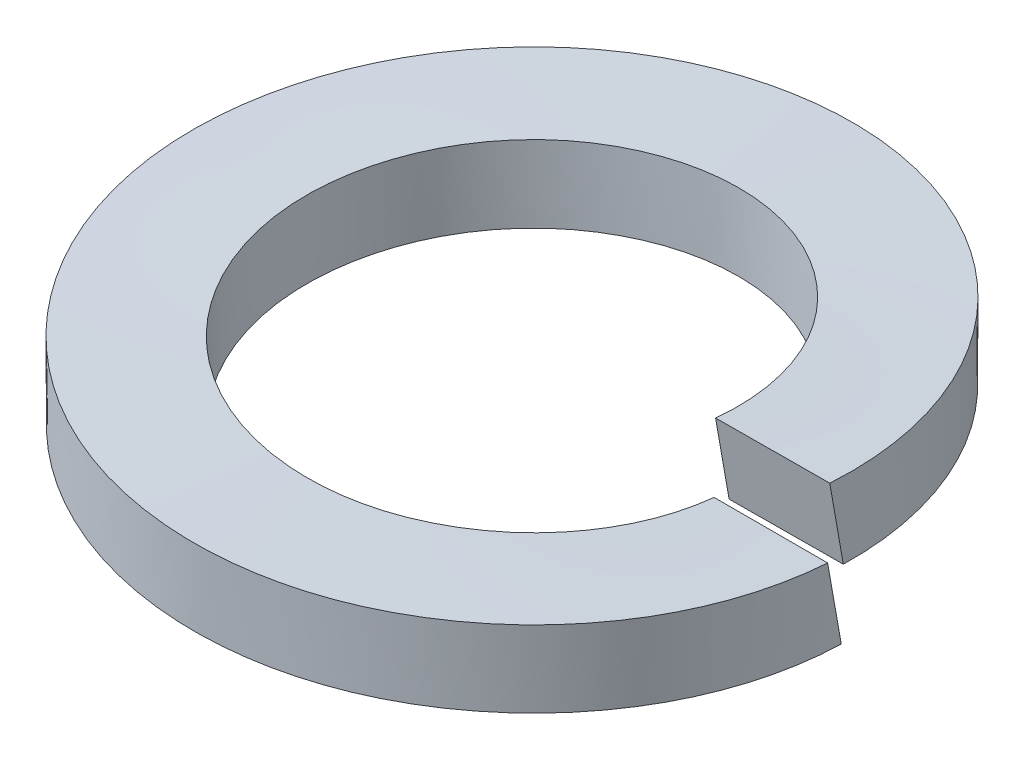
ISO-10303-21;
HEADER;
FILE_DESCRIPTION(('STEP AP214'),'2;1');
FILE_NAME('part.step','',(''),(''),'','','');
FILE_SCHEMA(('AUTOMOTIVE_DESIGN { 1 0 10303 214 1 1 1 1 }'));
ENDSEC;
DATA;
#1=APPLICATION_CONTEXT('core data for automotive mechanical design processes');
#2=APPLICATION_PROTOCOL_DEFINITION('international standard','automotive_design',2000,#1);
#3=PRODUCT_CONTEXT('',#1,'mechanical');
#4=PRODUCT('Part','Part','',(#3));
#5=PRODUCT_RELATED_PRODUCT_CATEGORY('part','',(#4));
#6=PRODUCT_DEFINITION_FORMATION('','',#4);
#7=PRODUCT_DEFINITION_CONTEXT('part definition',#1,'design');
#8=PRODUCT_DEFINITION('design','',#6,#7);
#9=PRODUCT_DEFINITION_SHAPE('','',#8);
#10=(LENGTH_UNIT() NAMED_UNIT(*) SI_UNIT(.MILLI.,.METRE.));
#11=(NAMED_UNIT(*) PLANE_ANGLE_UNIT() SI_UNIT($,.RADIAN.));
#12=(NAMED_UNIT(*) SI_UNIT($,.STERADIAN.) SOLID_ANGLE_UNIT());
#13=UNCERTAINTY_MEASURE_WITH_UNIT(LENGTH_MEASURE(1.E-05),#10,'distance_accuracy_value','');
#14=(GEOMETRIC_REPRESENTATION_CONTEXT(3) GLOBAL_UNCERTAINTY_ASSIGNED_CONTEXT((#13)) GLOBAL_UNIT_ASSIGNED_CONTEXT((#10,
#11,#12)) REPRESENTATION_CONTEXT('',''));
#15=CARTESIAN_POINT('',(0.,0.,0.));
#16=DIRECTION('',(0.,0.,1.));
#17=DIRECTION('',(1.,0.,0.));
#18=AXIS2_PLACEMENT_3D('',#15,#16,#17);
#19=CARTESIAN_POINT('',(9.50000000000001,0.,0.));
#20=DIRECTION('',(0.,-0.173648177666931,0.984807753012208));
#21=DIRECTION('',(0.,-0.984807753012208,-0.173648177666931));
#22=AXIS2_PLACEMENT_3D('',#19,#20,#21);
#23=PLANE('',#22);
#24=DIRECTION('',(0.,-0.984807753012208,-0.173648177666931));
#25=VECTOR('',#24,1.);
#26=CARTESIAN_POINT('',(9.50000000000001,3.39446208637528,0.598535250819876));
#27=LINE('',#26,#25);
#28=CARTESIAN_POINT('',(9.50000000000001,3.39446208637528,0.598535250819876));
#29=VERTEX_POINT('',#28);
#30=CARTESIAN_POINT('',(9.50000000000001,0.,0.));
#31=VERTEX_POINT('',#30);
#32=EDGE_CURVE('E72',#29,#31,#27,.T.);
#33=ORIENTED_EDGE('',*,*,#32,.F.);
#34=DIRECTION('',(-1.,0.,0.));
#35=VECTOR('',#34,1.);
#36=CARTESIAN_POINT('',(9.50000000000001,3.39446208637528,0.598535250819876));
#37=LINE('',#36,#35);
#38=CARTESIAN_POINT('',(14.5,3.39446208637528,0.598535250819876));
#39=VERTEX_POINT('',#38);
#40=EDGE_CURVE('E60',#39,#29,#37,.T.);
#41=ORIENTED_EDGE('',*,*,#40,.F.);
#42=DIRECTION('',(0.,0.984807753012208,0.173648177666931));
#43=VECTOR('',#42,1.);
#44=CARTESIAN_POINT('',(14.5,3.39446208637528,0.598535250819876));
#45=LINE('',#44,#43);
#46=CARTESIAN_POINT('',(14.5,0.,0.));
#47=VERTEX_POINT('',#46);
#48=EDGE_CURVE('E65',#47,#39,#45,.T.);
#49=ORIENTED_EDGE('',*,*,#48,.F.);
#50=DIRECTION('',(1.,0.,0.));
#51=VECTOR('',#50,1.);
#52=CARTESIAN_POINT('',(9.50000000000001,0.,0.));
#53=LINE('',#52,#51);
#54=EDGE_CURVE('E69',#31,#47,#53,.T.);
#55=ORIENTED_EDGE('',*,*,#54,.F.);
#56=EDGE_LOOP('',(#33,#41,#49,#55));
#57=FACE_BOUND('',#56,.T.);
#58=ADVANCED_FACE('F30',(#57),#23,.F.);
#59=CARTESIAN_POINT('',(9.49981247813331,2.99999999999989,-0.0596898676726854));
#60=DIRECTION('',(0.00618768889056106,-0.173648177666931,0.984788313750294));
#61=DIRECTION('',(-0.00109105649963595,-0.984807753012208,-0.17364475000057));
#62=AXIS2_PLACEMENT_3D('',#59,#60,#61);
#63=PLANE('',#62);
#64=DIRECTION('',(-0.00109105649963595,-0.984807753012208,-0.17364475000057));
#65=VECTOR('',#64,1.);
#66=CARTESIAN_POINT('',(9.5035731612827,6.3944620863754,0.538833568573871));
#67=LINE('',#66,#65);
#68=CARTESIAN_POINT('',(9.5035731612827,6.3944620863754,0.53883356857376));
#69=VERTEX_POINT('',#68);
#70=CARTESIAN_POINT('',(9.49981247813331,2.99999999999989,-0.0596898676726854));
#71=VERTEX_POINT('',#70);
#72=EDGE_CURVE('E86',#69,#71,#67,.T.);
#73=ORIENTED_EDGE('',*,*,#72,.T.);
#74=DIRECTION('',(0.999980260856137,0.,-0.00628314396554548));
#75=VECTOR('',#74,1.);
#76=CARTESIAN_POINT('',(9.49981247813331,2.99999999999989,-0.0596898676726854));
#77=LINE('',#76,#75);
#78=CARTESIAN_POINT('',(14.499713782414,2.99999999999989,-0.0911055875003619));
#79=VERTEX_POINT('',#78);
#80=EDGE_CURVE('E49',#71,#79,#77,.T.);
#81=ORIENTED_EDGE('',*,*,#80,.T.);
#82=DIRECTION('',(0.00109105649963595,0.984807753012208,0.17364475000057));
#83=VECTOR('',#82,1.);
#84=CARTESIAN_POINT('',(14.5034744655633,6.3944620863754,0.507417848746083));
#85=LINE('',#84,#83);
#86=CARTESIAN_POINT('',(14.5034744655633,6.3944620863754,0.507417848746083));
#87=VERTEX_POINT('',#86);
#88=EDGE_CURVE('E43',#79,#87,#85,.T.);
#89=ORIENTED_EDGE('',*,*,#88,.T.);
#90=DIRECTION('',(-0.999980260856137,0.,0.00628314396554548));
#91=VECTOR('',#90,1.);
#92=CARTESIAN_POINT('',(9.5035731612827,6.3944620863754,0.538833568573871));
#93=LINE('',#92,#91);
#94=EDGE_CURVE('E11',#87,#69,#93,.T.);
#95=ORIENTED_EDGE('',*,*,#94,.T.);
#96=EDGE_LOOP('',(#73,#81,#89,#95));
#97=FACE_BOUND('',#96,.T.);
#98=ADVANCED_FACE('F131',(#97),#63,.T.);
#99=CARTESIAN_POINT('',(9.50000000000001,3.39446208637528,0.598535250819876));
#100=CARTESIAN_POINT('',(9.15485324201067,3.64446208637537,6.07673256068097));
#101=CARTESIAN_POINT('',(4.24057988513876,3.89446208637545,8.52207291005136));
#102=CARTESIAN_POINT('',(-0.67369347173312,4.14446208637536,10.9674132594217));
#103=CARTESIAN_POINT('',(-5.25173088032527,4.39446208637539,7.93899031408352));
#104=CARTESIAN_POINT('',(-9.82976828891745,4.64446208637534,4.91056736874536));
#105=CARTESIAN_POINT('',(-9.50183347027145,4.89446208637534,-0.568687216053521));
#106=CARTESIAN_POINT('',(-9.17389865162553,5.14446208637533,-6.04794180085235));
#107=CARTESIAN_POINT('',(-4.26733179634092,5.39446208637528,-8.50870870264175));
#108=CARTESIAN_POINT('',(0.639235058943686,5.64446208637531,-10.9694756044312));
#109=CARTESIAN_POINT('',(5.22676393147231,5.89446208637545,-7.95544990878172));
#110=CARTESIAN_POINT('',(9.814292804001,6.14446208637529,-4.94142421313212));
#111=CARTESIAN_POINT('',(9.5035731612827,6.3944620863754,0.53883356857376));
#112=CARTESIAN_POINT('',(9.50000000000001,0.,0.));
#113=CARTESIAN_POINT('',(9.49999999999995,0.250000000000056,5.47819730986108));
#114=CARTESIAN_POINT('',(4.75861294092672,0.499999999999945,8.22226263740367));
#115=CARTESIAN_POINT('',(0.017225881853432,0.75000000000004,10.9663279649463));
#116=CARTESIAN_POINT('',(-4.73275850072519,0.99999999999989,8.23717166106264));
#117=CARTESIAN_POINT('',(-9.48274288330385,1.25000000000002,5.50801535717899));
#118=CARTESIAN_POINT('',(-9.49995311941765,1.50000000000006,0.0298450811158091));
#119=CARTESIAN_POINT('',(-9.51716335553147,1.75000000000001,-5.44832519494737));
#120=CARTESIAN_POINT('',(-4.78442041553967,2.,-8.20727246333197));
#121=CARTESIAN_POINT('',(-0.0516774755478602,2.24999999999999,-10.9662197317166));
#122=CARTESIAN_POINT('',(4.70685735010795,2.49999999999995,-8.25199938716281));
#123=CARTESIAN_POINT('',(9.46539217576376,2.74999999999998,-5.53777904260892));
#124=CARTESIAN_POINT('',(9.49981247813331,2.99999999999989,-0.0596898676726854));
#125=(BOUNDED_SURFACE() B_SPLINE_SURFACE(1,2,((#99,#100,#101,#102,#103,#104,#105,#106,#107,#108,
#109,#110,#111),(#112,#113,#114,#115,#116,#117,#118,#119,#120,#121,#122,#123,#124)),
.UNSPECIFIED.,.F.,.F.,.F.) B_SPLINE_SURFACE_WITH_KNOTS((2,2),(3,2,2,2,2,2,3),(0.,1.),(0.,
0.166666666666667,0.333333333333333,0.5,0.666666666666667,0.833333333333333,1.),
.UNSPECIFIED.) GEOMETRIC_REPRESENTATION_ITEM() RATIONAL_B_SPLINE_SURFACE(((1.,0.866287084447387,
1.,0.866287084447387,1.,0.866287084447387,1.,0.866287084447387,1.,0.866287084447387,1.,
0.866287084447387,1.),(1.,0.866287084447387,1.,0.866287084447387,1.,0.866287084447387,1.,
0.866287084447387,1.,0.866287084447387,1.,0.866287084447387,1.))) REPRESENTATION_ITEM('') SURFACE());
#126=CARTESIAN_POINT('',(9.50000000000001,0.,0.));
#127=CARTESIAN_POINT('',(9.49999999999995,0.250000000000056,5.47819730986108));
#128=CARTESIAN_POINT('',(4.75861294092672,0.499999999999945,8.22226263740367));
#129=CARTESIAN_POINT('',(0.017225881853432,0.75000000000004,10.9663279649463));
#130=CARTESIAN_POINT('',(-4.73275850072519,0.99999999999989,8.23717166106264));
#131=CARTESIAN_POINT('',(-9.48274288330385,1.25000000000002,5.50801535717899));
#132=CARTESIAN_POINT('',(-9.49995311941765,1.50000000000006,0.0298450811158091));
#133=CARTESIAN_POINT('',(-9.51716335553147,1.75000000000001,-5.44832519494737));
#134=CARTESIAN_POINT('',(-4.78442041553967,2.,-8.20727246333197));
#135=CARTESIAN_POINT('',(-0.0516774755478602,2.24999999999999,-10.9662197317166));
#136=CARTESIAN_POINT('',(4.70685735010795,2.49999999999995,-8.25199938716281));
#137=CARTESIAN_POINT('',(9.46539217576376,2.74999999999998,-5.53777904260892));
#138=CARTESIAN_POINT('',(9.49981247813331,2.99999999999989,-0.0596898676726854));
#139=(BOUNDED_CURVE() B_SPLINE_CURVE(2,(#126,#127,#128,#129,#130,#131,#132,#133,#134,#135,#136,
#137,#138),.UNSPECIFIED.,.F.,.F.) B_SPLINE_CURVE_WITH_KNOTS((3,2,2,2,2,2,3),(0.,
0.166666666666667,0.333333333333333,0.5,0.666666666666667,0.833333333333333,1.),
.UNSPECIFIED.) CURVE() GEOMETRIC_REPRESENTATION_ITEM() RATIONAL_B_SPLINE_CURVE((1.,
0.866287084447387,1.,0.866287084447387,1.,0.866287084447387,1.,0.866287084447387,1.,
0.866287084447387,1.,0.866287084447387,1.)) REPRESENTATION_ITEM(''));
#140=EDGE_CURVE('E88',#31,#71,#139,.T.);
#141=CARTESIAN_POINT('',(9.50000000000001,3.39446208637528,0.598535250819876));
#142=CARTESIAN_POINT('',(9.15485324201067,3.64446208637537,6.07673256068097));
#143=CARTESIAN_POINT('',(4.24057988513876,3.89446208637545,8.52207291005136));
#144=CARTESIAN_POINT('',(-0.67369347173312,4.14446208637536,10.9674132594217));
#145=CARTESIAN_POINT('',(-5.25173088032527,4.39446208637539,7.93899031408352));
#146=CARTESIAN_POINT('',(-9.82976828891745,4.64446208637534,4.91056736874536));
#147=CARTESIAN_POINT('',(-9.50183347027145,4.89446208637534,-0.568687216053521));
#148=CARTESIAN_POINT('',(-9.17389865162553,5.14446208637533,-6.04794180085235));
#149=CARTESIAN_POINT('',(-4.26733179634092,5.39446208637528,-8.50870870264175));
#150=CARTESIAN_POINT('',(0.639235058943686,5.64446208637531,-10.9694756044312));
#151=CARTESIAN_POINT('',(5.22676393147231,5.89446208637545,-7.95544990878172));
#152=CARTESIAN_POINT('',(9.814292804001,6.14446208637529,-4.94142421313212));
#153=CARTESIAN_POINT('',(9.5035731612827,6.3944620863754,0.53883356857376));
#154=(BOUNDED_CURVE() B_SPLINE_CURVE(2,(#141,#142,#143,#144,#145,#146,#147,#148,#149,#150,#151,
#152,#153),.UNSPECIFIED.,.F.,.F.) B_SPLINE_CURVE_WITH_KNOTS((3,2,2,2,2,2,3),(0.,
0.166666666666667,0.333333333333333,0.5,0.666666666666667,0.833333333333333,1.),
.UNSPECIFIED.) CURVE() GEOMETRIC_REPRESENTATION_ITEM() RATIONAL_B_SPLINE_CURVE((1.,
0.866287084447387,1.,0.866287084447387,1.,0.866287084447387,1.,0.866287084447387,1.,
0.866287084447387,1.,0.866287084447387,1.)) REPRESENTATION_ITEM(''));
#155=EDGE_CURVE('E82',#29,#69,#154,.T.);
#156=ORIENTED_EDGE('',*,*,#140,.T.);
#157=ORIENTED_EDGE('',*,*,#72,.F.);
#158=ORIENTED_EDGE('',*,*,#155,.F.);
#159=ORIENTED_EDGE('',*,*,#32,.T.);
#160=EDGE_LOOP('',(#156,#157,#158,#159));
#161=FACE_BOUND('',#160,.T.);
#162=ADVANCED_FACE('F85',(#161),#125,.T.);
#163=CARTESIAN_POINT('',(9.50000000000001,0.,0.));
#164=CARTESIAN_POINT('',(9.49999999999995,0.250000000000056,5.47819730986108));
#165=CARTESIAN_POINT('',(4.75861294092672,0.499999999999945,8.22226263740367));
#166=CARTESIAN_POINT('',(0.017225881853432,0.75000000000004,10.9663279649463));
#167=CARTESIAN_POINT('',(-4.73275850072519,0.99999999999989,8.23717166106264));
#168=CARTESIAN_POINT('',(-9.48274288330385,1.25000000000002,5.50801535717899));
#169=CARTESIAN_POINT('',(-9.49995311941765,1.50000000000006,0.0298450811158091));
#170=CARTESIAN_POINT('',(-9.51716335553147,1.75000000000001,-5.44832519494737));
#171=CARTESIAN_POINT('',(-4.78442041553967,2.,-8.20727246333197));
#172=CARTESIAN_POINT('',(-0.0516774755478602,2.24999999999999,-10.9662197317166));
#173=CARTESIAN_POINT('',(4.70685735010795,2.49999999999995,-8.25199938716281));
#174=CARTESIAN_POINT('',(9.46539217576376,2.74999999999998,-5.53777904260892));
#175=CARTESIAN_POINT('',(9.49981247813331,2.99999999999989,-0.0596898676726854));
#176=CARTESIAN_POINT('',(14.5,0.,0.));
#177=CARTESIAN_POINT('',(14.5,0.250000000000056,8.36145905189323));
#178=CARTESIAN_POINT('',(7.26314606773026,0.499999999999945,12.5497692886688));
#179=CARTESIAN_POINT('',(0.0262921354605757,0.75000000000004,16.7380795254443));
#180=CARTESIAN_POINT('',(-7.22368402742268,0.99999999999989,12.5725251668851));
#181=CARTESIAN_POINT('',(-14.4736601903059,1.25000000000002,8.40697080832579));
#182=CARTESIAN_POINT('',(-14.4999284454269,1.50000000000006,0.0455530185451414));
#183=CARTESIAN_POINT('',(-14.526196700548,1.75000000000001,-8.31586477123545));
#184=CARTESIAN_POINT('',(-7.30253642371842,2.,-12.5268895492962));
#185=CARTESIAN_POINT('',(-0.0788761468888257,2.24999999999999,-16.7379143273569));
#186=CARTESIAN_POINT('',(7.18415069227007,2.49999999999995,-12.5951569593536));
#187=CARTESIAN_POINT('',(14.4471775314289,2.74999999999998,-8.45239959135049));
#188=CARTESIAN_POINT('',(14.499713782414,2.99999999999989,-0.0911055875004729));
#189=(BOUNDED_SURFACE() B_SPLINE_SURFACE(1,2,((#163,#164,#165,#166,#167,#168,#169,#170,#171,
#172,#173,#174,#175),(#176,#177,#178,#179,#180,#181,#182,#183,#184,#185,#186,#187,#188)),
.UNSPECIFIED.,.F.,.F.,.F.) B_SPLINE_SURFACE_WITH_KNOTS((2,2),(3,2,2,2,2,2,3),(0.,1.),(0.,
0.166666666666667,0.333333333333333,0.5,0.666666666666667,0.833333333333333,1.),
.UNSPECIFIED.) GEOMETRIC_REPRESENTATION_ITEM() RATIONAL_B_SPLINE_SURFACE(((1.,0.866287084447387,
1.,0.866287084447387,1.,0.866287084447387,1.,0.866287084447387,1.,0.866287084447387,1.,
0.866287084447387,1.),(1.,0.866287084447387,1.,0.866287084447387,1.,0.866287084447387,1.,
0.866287084447387,1.,0.866287084447387,1.,0.866287084447387,1.))) REPRESENTATION_ITEM('') SURFACE());
#190=CARTESIAN_POINT('',(14.5,0.,0.));
#191=CARTESIAN_POINT('',(14.5,0.250000000000056,8.36145905189323));
#192=CARTESIAN_POINT('',(7.26314606773026,0.499999999999945,12.5497692886688));
#193=CARTESIAN_POINT('',(0.0262921354605757,0.75000000000004,16.7380795254443));
#194=CARTESIAN_POINT('',(-7.22368402742268,0.99999999999989,12.5725251668851));
#195=CARTESIAN_POINT('',(-14.4736601903059,1.25000000000002,8.40697080832579));
#196=CARTESIAN_POINT('',(-14.4999284454269,1.50000000000006,0.0455530185451414));
#197=CARTESIAN_POINT('',(-14.526196700548,1.75000000000001,-8.31586477123545));
#198=CARTESIAN_POINT('',(-7.30253642371842,2.,-12.5268895492962));
#199=CARTESIAN_POINT('',(-0.0788761468888257,2.24999999999999,-16.7379143273569));
#200=CARTESIAN_POINT('',(7.18415069227007,2.49999999999995,-12.5951569593536));
#201=CARTESIAN_POINT('',(14.4471775314289,2.74999999999998,-8.45239959135049));
#202=CARTESIAN_POINT('',(14.499713782414,2.99999999999989,-0.0911055875004729));
#203=(BOUNDED_CURVE() B_SPLINE_CURVE(2,(#190,#191,#192,#193,#194,#195,#196,#197,#198,#199,#200,
#201,#202),.UNSPECIFIED.,.F.,.F.) B_SPLINE_CURVE_WITH_KNOTS((3,2,2,2,2,2,3),(0.,
0.166666666666667,0.333333333333333,0.5,0.666666666666667,0.833333333333333,1.),
.UNSPECIFIED.) CURVE() GEOMETRIC_REPRESENTATION_ITEM() RATIONAL_B_SPLINE_CURVE((1.,
0.866287084447387,1.,0.866287084447387,1.,0.866287084447387,1.,0.866287084447387,1.,
0.866287084447387,1.,0.866287084447387,1.)) REPRESENTATION_ITEM(''));
#204=EDGE_CURVE('E102',#47,#79,#203,.T.);
#205=ORIENTED_EDGE('',*,*,#204,.T.);
#206=ORIENTED_EDGE('',*,*,#80,.F.);
#207=ORIENTED_EDGE('',*,*,#140,.F.);
#208=ORIENTED_EDGE('',*,*,#54,.T.);
#209=EDGE_LOOP('',(#205,#206,#207,#208));
#210=FACE_BOUND('',#209,.T.);
#211=ADVANCED_FACE('F123',(#210),#189,.T.);
#212=CARTESIAN_POINT('',(14.5,0.,0.));
#213=CARTESIAN_POINT('',(14.5,0.250000000000056,8.36145905189323));
#214=CARTESIAN_POINT('',(7.26314606773026,0.499999999999945,12.5497692886688));
#215=CARTESIAN_POINT('',(0.0262921354605757,0.75000000000004,16.7380795254443));
#216=CARTESIAN_POINT('',(-7.22368402742268,0.99999999999989,12.5725251668851));
#217=CARTESIAN_POINT('',(-14.4736601903059,1.25000000000002,8.40697080832579));
#218=CARTESIAN_POINT('',(-14.4999284454269,1.50000000000006,0.0455530185451414));
#219=CARTESIAN_POINT('',(-14.526196700548,1.75000000000001,-8.31586477123545));
#220=CARTESIAN_POINT('',(-7.30253642371842,2.,-12.5268895492962));
#221=CARTESIAN_POINT('',(-0.0788761468888257,2.24999999999999,-16.7379143273569));
#222=CARTESIAN_POINT('',(7.18415069227007,2.49999999999995,-12.5951569593536));
#223=CARTESIAN_POINT('',(14.4471775314289,2.74999999999998,-8.45239959135049));
#224=CARTESIAN_POINT('',(14.499713782414,2.99999999999989,-0.0911055875004729));
#225=CARTESIAN_POINT('',(14.5,3.39446208637528,0.598535250819876));
#226=CARTESIAN_POINT('',(14.1548532420106,3.64446208637537,8.95999430271312));
#227=CARTESIAN_POINT('',(6.7451130119423,3.89446208637545,12.8495795613164));
#228=CARTESIAN_POINT('',(-0.664627218126105,4.14446208637536,16.7391648199197));
#229=CARTESIAN_POINT('',(-7.74265640702276,4.39446208637539,12.274343819906));
#230=CARTESIAN_POINT('',(-14.8206855959195,4.64446208637534,7.80952281989217));
#231=CARTESIAN_POINT('',(-14.5018087962808,4.89446208637534,-0.552979278624077));
#232=CARTESIAN_POINT('',(-14.182931996642,5.14446208637533,-8.91548137714043));
#233=CARTESIAN_POINT('',(-6.78544780451973,5.39446208637528,-12.8283257886059));
#234=CARTESIAN_POINT('',(0.61203638760272,5.64446208637531,-16.7411702000715));
#235=CARTESIAN_POINT('',(7.70405727363443,5.89446208637545,-12.2986074809726));
#236=CARTESIAN_POINT('',(14.7960781596661,6.14446208637529,-7.8560447618737));
#237=CARTESIAN_POINT('',(14.5034744655633,6.3944620863754,0.507417848746083));
#238=(BOUNDED_SURFACE() B_SPLINE_SURFACE(1,2,((#212,#213,#214,#215,#216,#217,#218,#219,#220,
#221,#222,#223,#224),(#225,#226,#227,#228,#229,#230,#231,#232,#233,#234,#235,#236,#237)),
.UNSPECIFIED.,.F.,.F.,.F.) B_SPLINE_SURFACE_WITH_KNOTS((2,2),(3,2,2,2,2,2,3),(0.,1.),(0.,
0.166666666666667,0.333333333333333,0.5,0.666666666666667,0.833333333333333,1.),
.UNSPECIFIED.) GEOMETRIC_REPRESENTATION_ITEM() RATIONAL_B_SPLINE_SURFACE(((1.,0.866287084447387,
1.,0.866287084447387,1.,0.866287084447387,1.,0.866287084447387,1.,0.866287084447387,1.,
0.866287084447387,1.),(1.,0.866287084447387,1.,0.866287084447387,1.,0.866287084447387,1.,
0.866287084447387,1.,0.866287084447387,1.,0.866287084447387,1.))) REPRESENTATION_ITEM('') SURFACE());
#239=CARTESIAN_POINT('',(14.5,3.39446208637528,0.598535250819876));
#240=CARTESIAN_POINT('',(14.1548532420106,3.64446208637537,8.95999430271312));
#241=CARTESIAN_POINT('',(6.7451130119423,3.89446208637545,12.8495795613164));
#242=CARTESIAN_POINT('',(-0.664627218126105,4.14446208637536,16.7391648199197));
#243=CARTESIAN_POINT('',(-7.74265640702276,4.39446208637539,12.274343819906));
#244=CARTESIAN_POINT('',(-14.8206855959195,4.64446208637534,7.80952281989217));
#245=CARTESIAN_POINT('',(-14.5018087962808,4.89446208637534,-0.552979278624077));
#246=CARTESIAN_POINT('',(-14.182931996642,5.14446208637533,-8.91548137714043));
#247=CARTESIAN_POINT('',(-6.78544780451973,5.39446208637528,-12.8283257886059));
#248=CARTESIAN_POINT('',(0.61203638760272,5.64446208637531,-16.7411702000715));
#249=CARTESIAN_POINT('',(7.70405727363443,5.89446208637545,-12.2986074809726));
#250=CARTESIAN_POINT('',(14.7960781596661,6.14446208637529,-7.8560447618737));
#251=CARTESIAN_POINT('',(14.5034744655633,6.3944620863754,0.507417848746083));
#252=(BOUNDED_CURVE() B_SPLINE_CURVE(2,(#239,#240,#241,#242,#243,#244,#245,#246,#247,#248,#249,
#250,#251),.UNSPECIFIED.,.F.,.F.) B_SPLINE_CURVE_WITH_KNOTS((3,2,2,2,2,2,3),(0.,
0.166666666666667,0.333333333333333,0.5,0.666666666666667,0.833333333333333,1.),
.UNSPECIFIED.) CURVE() GEOMETRIC_REPRESENTATION_ITEM() RATIONAL_B_SPLINE_CURVE((1.,
0.866287084447387,1.,0.866287084447387,1.,0.866287084447387,1.,0.866287084447387,1.,
0.866287084447387,1.,0.866287084447387,1.)) REPRESENTATION_ITEM(''));
#253=EDGE_CURVE('E37',#39,#87,#252,.T.);
#254=ORIENTED_EDGE('',*,*,#253,.T.);
#255=ORIENTED_EDGE('',*,*,#88,.F.);
#256=ORIENTED_EDGE('',*,*,#204,.F.);
#257=ORIENTED_EDGE('',*,*,#48,.T.);
#258=EDGE_LOOP('',(#254,#255,#256,#257));
#259=FACE_BOUND('',#258,.T.);
#260=ADVANCED_FACE('F120',(#259),#238,.T.);
#261=CARTESIAN_POINT('',(14.5,3.39446208637528,0.598535250819876));
#262=CARTESIAN_POINT('',(14.1548532420106,3.64446208637537,8.95999430271312));
#263=CARTESIAN_POINT('',(6.7451130119423,3.89446208637545,12.8495795613164));
#264=CARTESIAN_POINT('',(-0.664627218126105,4.14446208637536,16.7391648199197));
#265=CARTESIAN_POINT('',(-7.74265640702276,4.39446208637539,12.274343819906));
#266=CARTESIAN_POINT('',(-14.8206855959195,4.64446208637534,7.80952281989217));
#267=CARTESIAN_POINT('',(-14.5018087962808,4.89446208637534,-0.552979278624077));
#268=CARTESIAN_POINT('',(-14.182931996642,5.14446208637533,-8.91548137714043));
#269=CARTESIAN_POINT('',(-6.78544780451973,5.39446208637528,-12.8283257886059));
#270=CARTESIAN_POINT('',(0.61203638760272,5.64446208637531,-16.7411702000715));
#271=CARTESIAN_POINT('',(7.70405727363443,5.89446208637545,-12.2986074809726));
#272=CARTESIAN_POINT('',(14.7960781596661,6.14446208637529,-7.8560447618737));
#273=CARTESIAN_POINT('',(14.5034744655633,6.3944620863754,0.507417848746083));
#274=CARTESIAN_POINT('',(9.50000000000001,3.39446208637528,0.598535250819876));
#275=CARTESIAN_POINT('',(9.15485324201067,3.64446208637537,6.07673256068097));
#276=CARTESIAN_POINT('',(4.24057988513876,3.89446208637545,8.52207291005136));
#277=CARTESIAN_POINT('',(-0.67369347173312,4.14446208637536,10.9674132594217));
#278=CARTESIAN_POINT('',(-5.25173088032527,4.39446208637539,7.93899031408352));
#279=CARTESIAN_POINT('',(-9.82976828891745,4.64446208637534,4.91056736874536));
#280=CARTESIAN_POINT('',(-9.50183347027145,4.89446208637534,-0.568687216053521));
#281=CARTESIAN_POINT('',(-9.17389865162553,5.14446208637533,-6.04794180085235));
#282=CARTESIAN_POINT('',(-4.26733179634092,5.39446208637528,-8.50870870264175));
#283=CARTESIAN_POINT('',(0.639235058943686,5.64446208637531,-10.9694756044312));
#284=CARTESIAN_POINT('',(5.22676393147231,5.89446208637545,-7.95544990878172));
#285=CARTESIAN_POINT('',(9.814292804001,6.14446208637529,-4.94142421313212));
#286=CARTESIAN_POINT('',(9.5035731612827,6.3944620863754,0.53883356857376));
#287=(BOUNDED_SURFACE() B_SPLINE_SURFACE(1,2,((#261,#262,#263,#264,#265,#266,#267,#268,#269,
#270,#271,#272,#273),(#274,#275,#276,#277,#278,#279,#280,#281,#282,#283,#284,#285,#286)),
.UNSPECIFIED.,.F.,.F.,.F.) B_SPLINE_SURFACE_WITH_KNOTS((2,2),(3,2,2,2,2,2,3),(0.,1.),(0.,
0.166666666666667,0.333333333333333,0.5,0.666666666666667,0.833333333333333,1.),
.UNSPECIFIED.) GEOMETRIC_REPRESENTATION_ITEM() RATIONAL_B_SPLINE_SURFACE(((1.,0.866287084447387,
1.,0.866287084447387,1.,0.866287084447387,1.,0.866287084447387,1.,0.866287084447387,1.,
0.866287084447387,1.),(1.,0.866287084447387,1.,0.866287084447387,1.,0.866287084447387,1.,
0.866287084447387,1.,0.866287084447387,1.,0.866287084447387,1.))) REPRESENTATION_ITEM('') SURFACE());
#288=ORIENTED_EDGE('',*,*,#94,.F.);
#289=ORIENTED_EDGE('',*,*,#253,.F.);
#290=ORIENTED_EDGE('',*,*,#40,.T.);
#291=ORIENTED_EDGE('',*,*,#155,.T.);
#292=EDGE_LOOP('',(#288,#289,#290,#291));
#293=FACE_BOUND('',#292,.T.);
#294=ADVANCED_FACE('F81',(#293),#287,.T.);
#295=CLOSED_SHELL('',(#58,#98,#162,#211,#260,#294));
#296=MANIFOLD_SOLID_BREP('B2',#295);
#297=ADVANCED_BREP_SHAPE_REPRESENTATION('',(#18,#296),#14);
#298=SHAPE_DEFINITION_REPRESENTATION(#9,#297);
ENDSEC;
END-ISO-10303-21;
